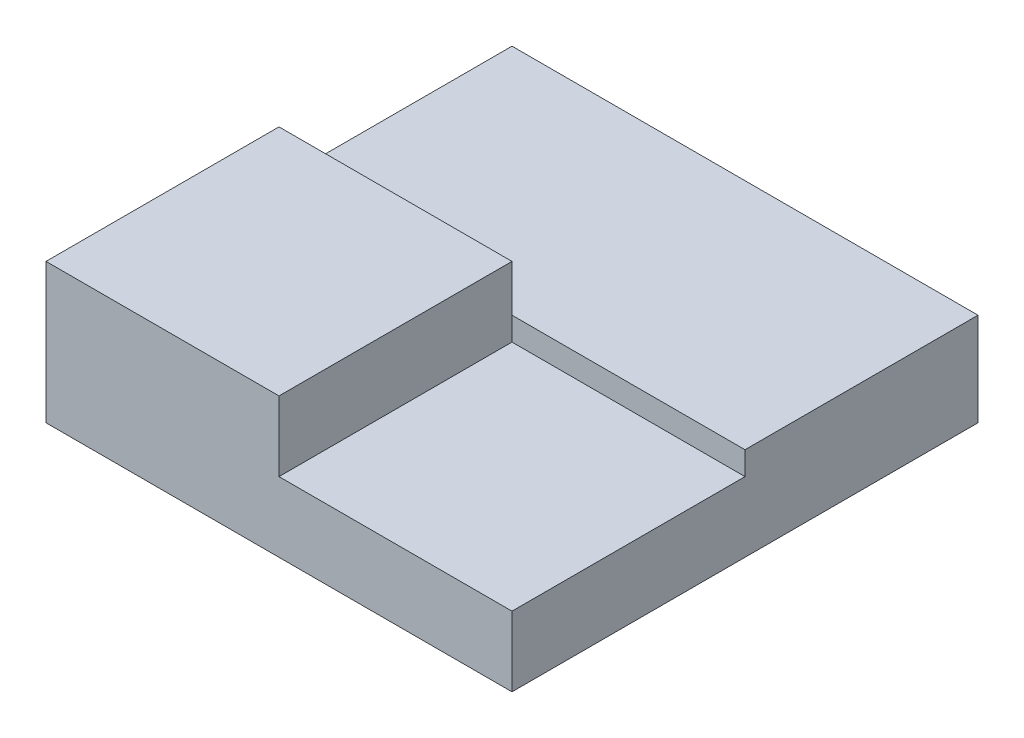
ISO-10303-21;
HEADER;
FILE_DESCRIPTION(('STEP AP214'),'2;1');
FILE_NAME('part.step','',(''),(''),'','','');
FILE_SCHEMA(('AUTOMOTIVE_DESIGN { 1 0 10303 214 1 1 1 1 }'));
ENDSEC;
DATA;
#1=APPLICATION_CONTEXT('core data for automotive mechanical design processes');
#2=APPLICATION_PROTOCOL_DEFINITION('international standard','automotive_design',2000,#1);
#3=PRODUCT_CONTEXT('',#1,'mechanical');
#4=PRODUCT('Part','Part','',(#3));
#5=PRODUCT_RELATED_PRODUCT_CATEGORY('part','',(#4));
#6=PRODUCT_DEFINITION_FORMATION('','',#4);
#7=PRODUCT_DEFINITION_CONTEXT('part definition',#1,'design');
#8=PRODUCT_DEFINITION('design','',#6,#7);
#9=PRODUCT_DEFINITION_SHAPE('','',#8);
#10=(LENGTH_UNIT() NAMED_UNIT(*) SI_UNIT(.MILLI.,.METRE.));
#11=(NAMED_UNIT(*) PLANE_ANGLE_UNIT() SI_UNIT($,.RADIAN.));
#12=(NAMED_UNIT(*) SI_UNIT($,.STERADIAN.) SOLID_ANGLE_UNIT());
#13=UNCERTAINTY_MEASURE_WITH_UNIT(LENGTH_MEASURE(1.E-05),#10,'distance_accuracy_value','');
#14=(GEOMETRIC_REPRESENTATION_CONTEXT(3) GLOBAL_UNCERTAINTY_ASSIGNED_CONTEXT((#13)) GLOBAL_UNIT_ASSIGNED_CONTEXT((#10,
#11,#12)) REPRESENTATION_CONTEXT('',''));
#15=CARTESIAN_POINT('',(0.,0.,0.));
#16=DIRECTION('',(0.,0.,1.));
#17=DIRECTION('',(1.,0.,0.));
#18=AXIS2_PLACEMENT_3D('',#15,#16,#17);
#19=CARTESIAN_POINT('',(-0.5,0.3,-0.5));
#20=DIRECTION('',(0.,0.,1.));
#21=DIRECTION('',(1.,0.,0.));
#22=AXIS2_PLACEMENT_3D('',#19,#20,#21);
#23=PLANE('',#22);
#24=DIRECTION('',(-1.,0.,0.));
#25=VECTOR('',#24,1.);
#26=CARTESIAN_POINT('',(-0.5,0.2,-0.5));
#27=LINE('',#26,#25);
#28=CARTESIAN_POINT('',(0.5,0.2,-0.5));
#29=VERTEX_POINT('',#28);
#30=CARTESIAN_POINT('',(-0.5,0.2,-0.5));
#31=VERTEX_POINT('',#30);
#32=EDGE_CURVE('E82',#29,#31,#27,.T.);
#33=ORIENTED_EDGE('',*,*,#32,.F.);
#34=DIRECTION('',(0.,-1.,0.));
#35=VECTOR('',#34,1.);
#36=CARTESIAN_POINT('',(0.5,0.3,-0.5));
#37=LINE('',#36,#35);
#38=CARTESIAN_POINT('',(0.5,0.,-0.5));
#39=VERTEX_POINT('',#38);
#40=EDGE_CURVE('E74',#29,#39,#37,.T.);
#41=ORIENTED_EDGE('',*,*,#40,.T.);
#42=DIRECTION('',(-1.,0.,0.));
#43=VECTOR('',#42,1.);
#44=CARTESIAN_POINT('',(-0.5,0.,-0.5));
#45=LINE('',#44,#43);
#46=CARTESIAN_POINT('',(-0.5,0.,-0.5));
#47=VERTEX_POINT('',#46);
#48=EDGE_CURVE('E78',#39,#47,#45,.T.);
#49=ORIENTED_EDGE('',*,*,#48,.T.);
#50=DIRECTION('',(0.,-1.,0.));
#51=VECTOR('',#50,1.);
#52=CARTESIAN_POINT('',(-0.5,0.3,-0.5));
#53=LINE('',#52,#51);
#54=EDGE_CURVE('E85',#31,#47,#53,.T.);
#55=ORIENTED_EDGE('',*,*,#54,.F.);
#56=EDGE_LOOP('',(#33,#41,#49,#55));
#57=FACE_BOUND('',#56,.T.);
#58=ADVANCED_FACE('F32',(#57),#23,.F.);
#59=CARTESIAN_POINT('',(-0.5,0.3,-0.5));
#60=DIRECTION('',(1.,0.,0.));
#61=DIRECTION('',(0.,0.,-1.));
#62=AXIS2_PLACEMENT_3D('',#59,#60,#61);
#63=PLANE('',#62);
#64=DIRECTION('',(0.,0.,1.));
#65=VECTOR('',#64,1.);
#66=CARTESIAN_POINT('',(-0.5,0.3,-0.5));
#67=LINE('',#66,#65);
#68=CARTESIAN_POINT('',(-0.5,0.3,0.));
#69=VERTEX_POINT('',#68);
#70=CARTESIAN_POINT('',(-0.5,0.3,0.5));
#71=VERTEX_POINT('',#70);
#72=EDGE_CURVE('E55',#69,#71,#67,.T.);
#73=ORIENTED_EDGE('',*,*,#72,.F.);
#74=DIRECTION('',(0.,1.,0.));
#75=VECTOR('',#74,1.);
#76=CARTESIAN_POINT('',(-0.5,0.2,0.));
#77=LINE('',#76,#75);
#78=CARTESIAN_POINT('',(-0.5,0.2,0.));
#79=VERTEX_POINT('',#78);
#80=EDGE_CURVE('E47',#79,#69,#77,.T.);
#81=ORIENTED_EDGE('',*,*,#80,.F.);
#82=DIRECTION('',(0.,0.,1.));
#83=VECTOR('',#82,1.);
#84=CARTESIAN_POINT('',(-0.5,0.2,-0.5));
#85=LINE('',#84,#83);
#86=EDGE_CURVE('E191',#31,#79,#85,.T.);
#87=ORIENTED_EDGE('',*,*,#86,.F.);
#88=ORIENTED_EDGE('',*,*,#54,.T.);
#89=DIRECTION('',(0.,0.,1.));
#90=VECTOR('',#89,1.);
#91=CARTESIAN_POINT('',(-0.5,0.,-0.5));
#92=LINE('',#91,#90);
#93=CARTESIAN_POINT('',(-0.5,0.,0.5));
#94=VERTEX_POINT('',#93);
#95=EDGE_CURVE('E98',#47,#94,#92,.T.);
#96=ORIENTED_EDGE('',*,*,#95,.T.);
#97=DIRECTION('',(0.,-1.,0.));
#98=VECTOR('',#97,1.);
#99=CARTESIAN_POINT('',(-0.5,0.3,0.5));
#100=LINE('',#99,#98);
#101=EDGE_CURVE('E11',#71,#94,#100,.T.);
#102=ORIENTED_EDGE('',*,*,#101,.F.);
#103=EDGE_LOOP('',(#73,#81,#87,#88,#96,#102));
#104=FACE_BOUND('',#103,.T.);
#105=ADVANCED_FACE('F34',(#104),#63,.F.);
#106=CARTESIAN_POINT('',(-0.5,0.3,0.5));
#107=DIRECTION('',(0.,0.,-1.));
#108=DIRECTION('',(-1.,0.,0.));
#109=AXIS2_PLACEMENT_3D('',#106,#107,#108);
#110=PLANE('',#109);
#111=DIRECTION('',(1.,0.,0.));
#112=VECTOR('',#111,1.);
#113=CARTESIAN_POINT('',(0.,0.15,0.5));
#114=LINE('',#113,#112);
#115=CARTESIAN_POINT('',(0.,0.15,0.5));
#116=VERTEX_POINT('',#115);
#117=CARTESIAN_POINT('',(0.5,0.15,0.5));
#118=VERTEX_POINT('',#117);
#119=EDGE_CURVE('E165',#116,#118,#114,.T.);
#120=ORIENTED_EDGE('',*,*,#119,.F.);
#121=DIRECTION('',(0.,1.,0.));
#122=VECTOR('',#121,1.);
#123=CARTESIAN_POINT('',(0.,0.15,0.5));
#124=LINE('',#123,#122);
#125=CARTESIAN_POINT('',(0.,0.3,0.5));
#126=VERTEX_POINT('',#125);
#127=EDGE_CURVE('E175',#116,#126,#124,.T.);
#128=ORIENTED_EDGE('',*,*,#127,.T.);
#129=DIRECTION('',(1.,0.,0.));
#130=VECTOR('',#129,1.);
#131=CARTESIAN_POINT('',(-0.5,0.3,0.5));
#132=LINE('',#131,#130);
#133=EDGE_CURVE('E100',#71,#126,#132,.T.);
#134=ORIENTED_EDGE('',*,*,#133,.F.);
#135=ORIENTED_EDGE('',*,*,#101,.T.);
#136=DIRECTION('',(1.,0.,0.));
#137=VECTOR('',#136,1.);
#138=CARTESIAN_POINT('',(-0.5,0.,0.5));
#139=LINE('',#138,#137);
#140=CARTESIAN_POINT('',(0.5,0.,0.5));
#141=VERTEX_POINT('',#140);
#142=EDGE_CURVE('E94',#94,#141,#139,.T.);
#143=ORIENTED_EDGE('',*,*,#142,.T.);
#144=DIRECTION('',(0.,-1.,0.));
#145=VECTOR('',#144,1.);
#146=CARTESIAN_POINT('',(0.5,0.3,0.5));
#147=LINE('',#146,#145);
#148=EDGE_CURVE('E40',#118,#141,#147,.T.);
#149=ORIENTED_EDGE('',*,*,#148,.F.);
#150=EDGE_LOOP('',(#120,#128,#134,#135,#143,#149));
#151=FACE_BOUND('',#150,.T.);
#152=ADVANCED_FACE('F113',(#151),#110,.F.);
#153=CARTESIAN_POINT('',(0.5,0.3,-0.5));
#154=DIRECTION('',(-1.,0.,0.));
#155=DIRECTION('',(0.,0.,1.));
#156=AXIS2_PLACEMENT_3D('',#153,#154,#155);
#157=PLANE('',#156);
#158=DIRECTION('',(0.,0.,-1.));
#159=VECTOR('',#158,1.);
#160=CARTESIAN_POINT('',(0.5,0.2,-0.5));
#161=LINE('',#160,#159);
#162=CARTESIAN_POINT('',(0.5,0.2,0.));
#163=VERTEX_POINT('',#162);
#164=EDGE_CURVE('E198',#163,#29,#161,.T.);
#165=ORIENTED_EDGE('',*,*,#164,.F.);
#166=DIRECTION('',(0.,1.,0.));
#167=VECTOR('',#166,1.);
#168=CARTESIAN_POINT('',(0.5,0.15,0.));
#169=LINE('',#168,#167);
#170=CARTESIAN_POINT('',(0.5,0.15,0.));
#171=VERTEX_POINT('',#170);
#172=EDGE_CURVE('E187',#171,#163,#169,.T.);
#173=ORIENTED_EDGE('',*,*,#172,.F.);
#174=DIRECTION('',(0.,0.,-1.));
#175=VECTOR('',#174,1.);
#176=CARTESIAN_POINT('',(0.5,0.15,0.));
#177=LINE('',#176,#175);
#178=EDGE_CURVE('E176',#118,#171,#177,.T.);
#179=ORIENTED_EDGE('',*,*,#178,.F.);
#180=ORIENTED_EDGE('',*,*,#148,.T.);
#181=DIRECTION('',(0.,0.,-1.));
#182=VECTOR('',#181,1.);
#183=CARTESIAN_POINT('',(0.5,0.,-0.5));
#184=LINE('',#183,#182);
#185=EDGE_CURVE('E88',#141,#39,#184,.T.);
#186=ORIENTED_EDGE('',*,*,#185,.T.);
#187=ORIENTED_EDGE('',*,*,#40,.F.);
#188=EDGE_LOOP('',(#165,#173,#179,#180,#186,#187));
#189=FACE_BOUND('',#188,.T.);
#190=ADVANCED_FACE('F89',(#189),#157,.F.);
#191=CARTESIAN_POINT('',(0.,0.3,0.));
#192=DIRECTION('',(0.,1.,0.));
#193=DIRECTION('',(0.,0.,1.));
#194=AXIS2_PLACEMENT_3D('',#191,#192,#193);
#195=PLANE('',#194);
#196=DIRECTION('',(0.,0.,1.));
#197=VECTOR('',#196,1.);
#198=CARTESIAN_POINT('',(0.,0.3,0.));
#199=LINE('',#198,#197);
#200=CARTESIAN_POINT('',(0.,0.3,0.));
#201=VERTEX_POINT('',#200);
#202=EDGE_CURVE('E173',#201,#126,#199,.T.);
#203=ORIENTED_EDGE('',*,*,#202,.F.);
#204=DIRECTION('',(1.,0.,0.));
#205=VECTOR('',#204,1.);
#206=CARTESIAN_POINT('',(-0.5,0.3,0.));
#207=LINE('',#206,#205);
#208=EDGE_CURVE('E185',#69,#201,#207,.T.);
#209=ORIENTED_EDGE('',*,*,#208,.F.);
#210=ORIENTED_EDGE('',*,*,#72,.T.);
#211=ORIENTED_EDGE('',*,*,#133,.T.);
#212=EDGE_LOOP('',(#203,#209,#210,#211));
#213=FACE_BOUND('',#212,.T.);
#214=ADVANCED_FACE('F130',(#213),#195,.T.);
#215=CARTESIAN_POINT('',(0.,0.,0.));
#216=DIRECTION('',(0.,1.,0.));
#217=DIRECTION('',(0.,0.,1.));
#218=AXIS2_PLACEMENT_3D('',#215,#216,#217);
#219=PLANE('',#218);
#220=ORIENTED_EDGE('',*,*,#95,.F.);
#221=ORIENTED_EDGE('',*,*,#48,.F.);
#222=ORIENTED_EDGE('',*,*,#185,.F.);
#223=ORIENTED_EDGE('',*,*,#142,.F.);
#224=EDGE_LOOP('',(#220,#221,#222,#223));
#225=FACE_BOUND('',#224,.T.);
#226=ADVANCED_FACE('F96',(#225),#219,.F.);
#227=CARTESIAN_POINT('',(-0.5,0.2,0.));
#228=DIRECTION('',(0.,0.,1.));
#229=DIRECTION('',(1.,0.,0.));
#230=AXIS2_PLACEMENT_3D('',#227,#228,#229);
#231=PLANE('',#230);
#232=ORIENTED_EDGE('',*,*,#208,.T.);
#233=DIRECTION('',(0.,1.,0.));
#234=VECTOR('',#233,1.);
#235=CARTESIAN_POINT('',(0.,0.15,0.));
#236=LINE('',#235,#234);
#237=CARTESIAN_POINT('',(0.,0.2,0.));
#238=VERTEX_POINT('',#237);
#239=EDGE_CURVE('E186',#238,#201,#236,.T.);
#240=ORIENTED_EDGE('',*,*,#239,.F.);
#241=DIRECTION('',(1.,0.,0.));
#242=VECTOR('',#241,1.);
#243=CARTESIAN_POINT('',(-0.5,0.2,0.));
#244=LINE('',#243,#242);
#245=EDGE_CURVE('E195',#79,#238,#244,.T.);
#246=ORIENTED_EDGE('',*,*,#245,.F.);
#247=ORIENTED_EDGE('',*,*,#80,.T.);
#248=EDGE_LOOP('',(#232,#240,#246,#247));
#249=FACE_BOUND('',#248,.T.);
#250=ADVANCED_FACE('F138',(#249),#231,.F.);
#251=CARTESIAN_POINT('',(0.,0.2,0.));
#252=DIRECTION('',(0.,1.,0.));
#253=DIRECTION('',(0.,0.,1.));
#254=AXIS2_PLACEMENT_3D('',#251,#252,#253);
#255=PLANE('',#254);
#256=ORIENTED_EDGE('',*,*,#86,.T.);
#257=ORIENTED_EDGE('',*,*,#245,.T.);
#258=EDGE_CURVE('E194',#238,#163,#244,.T.);
#259=ORIENTED_EDGE('',*,*,#258,.T.);
#260=ORIENTED_EDGE('',*,*,#164,.T.);
#261=ORIENTED_EDGE('',*,*,#32,.T.);
#262=EDGE_LOOP('',(#256,#257,#259,#260,#261));
#263=FACE_BOUND('',#262,.T.);
#264=ADVANCED_FACE('F141',(#263),#255,.T.);
#265=CARTESIAN_POINT('',(0.,0.15,0.));
#266=DIRECTION('',(-1.,0.,0.));
#267=DIRECTION('',(0.,0.,1.));
#268=AXIS2_PLACEMENT_3D('',#265,#266,#267);
#269=PLANE('',#268);
#270=ORIENTED_EDGE('',*,*,#202,.T.);
#271=ORIENTED_EDGE('',*,*,#127,.F.);
#272=DIRECTION('',(0.,0.,1.));
#273=VECTOR('',#272,1.);
#274=CARTESIAN_POINT('',(0.,0.15,0.));
#275=LINE('',#274,#273);
#276=CARTESIAN_POINT('',(0.,0.15,0.));
#277=VERTEX_POINT('',#276);
#278=EDGE_CURVE('E163',#277,#116,#275,.T.);
#279=ORIENTED_EDGE('',*,*,#278,.F.);
#280=EDGE_CURVE('E183',#277,#238,#236,.T.);
#281=ORIENTED_EDGE('',*,*,#280,.T.);
#282=ORIENTED_EDGE('',*,*,#239,.T.);
#283=EDGE_LOOP('',(#270,#271,#279,#281,#282));
#284=FACE_BOUND('',#283,.T.);
#285=ADVANCED_FACE('F144',(#284),#269,.F.);
#286=CARTESIAN_POINT('',(0.,0.15,0.));
#287=DIRECTION('',(0.,0.,-1.));
#288=DIRECTION('',(-1.,0.,0.));
#289=AXIS2_PLACEMENT_3D('',#286,#287,#288);
#290=PLANE('',#289);
#291=ORIENTED_EDGE('',*,*,#258,.F.);
#292=ORIENTED_EDGE('',*,*,#280,.F.);
#293=DIRECTION('',(-1.,0.,0.));
#294=VECTOR('',#293,1.);
#295=CARTESIAN_POINT('',(0.,0.15,0.));
#296=LINE('',#295,#294);
#297=EDGE_CURVE('E168',#171,#277,#296,.T.);
#298=ORIENTED_EDGE('',*,*,#297,.F.);
#299=ORIENTED_EDGE('',*,*,#172,.T.);
#300=EDGE_LOOP('',(#291,#292,#298,#299));
#301=FACE_BOUND('',#300,.T.);
#302=ADVANCED_FACE('F148',(#301),#290,.F.);
#303=CARTESIAN_POINT('',(0.,0.15,0.));
#304=DIRECTION('',(0.,1.,0.));
#305=DIRECTION('',(0.,0.,1.));
#306=AXIS2_PLACEMENT_3D('',#303,#304,#305);
#307=PLANE('',#306);
#308=ORIENTED_EDGE('',*,*,#278,.T.);
#309=ORIENTED_EDGE('',*,*,#119,.T.);
#310=ORIENTED_EDGE('',*,*,#178,.T.);
#311=ORIENTED_EDGE('',*,*,#297,.T.);
#312=EDGE_LOOP('',(#308,#309,#310,#311));
#313=FACE_BOUND('',#312,.T.);
#314=ADVANCED_FACE('F152',(#313),#307,.T.);
#315=CLOSED_SHELL('',(#58,#105,#152,#190,#214,#226,#250,#264,#285,#302,#314));
#316=MANIFOLD_SOLID_BREP('B2',#315);
#317=ADVANCED_BREP_SHAPE_REPRESENTATION('',(#18,#316),#14);
#318=SHAPE_DEFINITION_REPRESENTATION(#9,#317);
ENDSEC;
END-ISO-10303-21;
